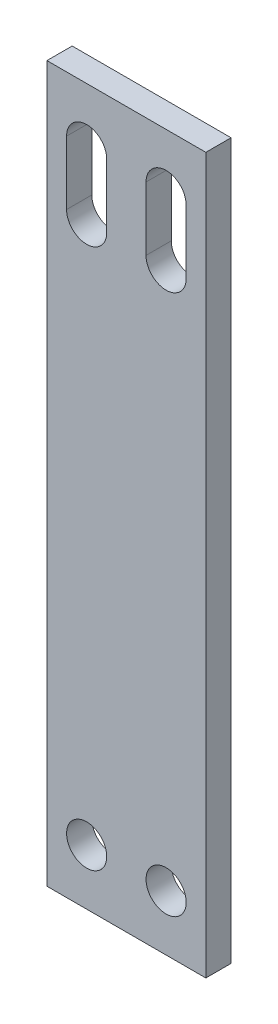
ISO-10303-21;
HEADER;
FILE_DESCRIPTION(('STEP AP214'),'2;1');
FILE_NAME('part.step','',(''),(''),'','','');
FILE_SCHEMA(('AUTOMOTIVE_DESIGN { 1 0 10303 214 1 1 1 1 }'));
ENDSEC;
DATA;
#1=APPLICATION_CONTEXT('core data for automotive mechanical design processes');
#2=APPLICATION_PROTOCOL_DEFINITION('international standard','automotive_design',2000,#1);
#3=PRODUCT_CONTEXT('',#1,'mechanical');
#4=PRODUCT('Part','Part','',(#3));
#5=PRODUCT_RELATED_PRODUCT_CATEGORY('part','',(#4));
#6=PRODUCT_DEFINITION_FORMATION('','',#4);
#7=PRODUCT_DEFINITION_CONTEXT('part definition',#1,'design');
#8=PRODUCT_DEFINITION('design','',#6,#7);
#9=PRODUCT_DEFINITION_SHAPE('','',#8);
#10=(LENGTH_UNIT() NAMED_UNIT(*) SI_UNIT(.MILLI.,.METRE.));
#11=(NAMED_UNIT(*) PLANE_ANGLE_UNIT() SI_UNIT($,.RADIAN.));
#12=(NAMED_UNIT(*) SI_UNIT($,.STERADIAN.) SOLID_ANGLE_UNIT());
#13=UNCERTAINTY_MEASURE_WITH_UNIT(LENGTH_MEASURE(1.E-05),#10,'distance_accuracy_value','');
#14=(GEOMETRIC_REPRESENTATION_CONTEXT(3) GLOBAL_UNCERTAINTY_ASSIGNED_CONTEXT((#13)) GLOBAL_UNIT_ASSIGNED_CONTEXT((#10,
#11,#12)) REPRESENTATION_CONTEXT('',''));
#15=CARTESIAN_POINT('',(0.,0.,0.));
#16=DIRECTION('',(0.,0.,1.));
#17=DIRECTION('',(1.,0.,0.));
#18=AXIS2_PLACEMENT_3D('',#15,#16,#17);
#19=CARTESIAN_POINT('',(0.,0.,3.175));
#20=DIRECTION('',(0.,0.,-1.));
#21=DIRECTION('',(-1.,0.,0.));
#22=AXIS2_PLACEMENT_3D('',#19,#20,#21);
#23=PLANE('',#22);
#24=CARTESIAN_POINT('',(4.99999999999999,83.,3.175));
#25=DIRECTION('',(0.,0.,1.));
#26=DIRECTION('',(1.,0.,0.));
#27=AXIS2_PLACEMENT_3D('',#24,#25,#26);
#28=CIRCLE('',#27,2.5273);
#29=CARTESIAN_POINT('',(7.52729999999999,83.,3.175));
#30=VERTEX_POINT('',#29);
#31=CARTESIAN_POINT('',(2.47269999999999,83.,3.175));
#32=VERTEX_POINT('',#31);
#33=EDGE_CURVE('E158',#30,#32,#28,.T.);
#34=ORIENTED_EDGE('',*,*,#33,.F.);
#35=DIRECTION('',(0.,1.,0.));
#36=VECTOR('',#35,1.);
#37=CARTESIAN_POINT('',(7.52729999999999,83.,3.175));
#38=LINE('',#37,#36);
#39=CARTESIAN_POINT('',(7.52729999999999,75.,3.175));
#40=VERTEX_POINT('',#39);
#41=EDGE_CURVE('E166',#40,#30,#38,.T.);
#42=ORIENTED_EDGE('',*,*,#41,.F.);
#43=CARTESIAN_POINT('',(4.99999999999999,75.,3.175));
#44=DIRECTION('',(0.,0.,1.));
#45=DIRECTION('',(1.,0.,0.));
#46=AXIS2_PLACEMENT_3D('',#43,#44,#45);
#47=CIRCLE('',#46,2.5273);
#48=CARTESIAN_POINT('',(2.47269999999999,75.,3.175));
#49=VERTEX_POINT('',#48);
#50=EDGE_CURVE('E163',#49,#40,#47,.T.);
#51=ORIENTED_EDGE('',*,*,#50,.F.);
#52=DIRECTION('',(0.,-1.,0.));
#53=VECTOR('',#52,1.);
#54=CARTESIAN_POINT('',(2.47269999999999,83.,3.175));
#55=LINE('',#54,#53);
#56=EDGE_CURVE('E160',#32,#49,#55,.T.);
#57=ORIENTED_EDGE('',*,*,#56,.F.);
#58=EDGE_LOOP('',(#34,#42,#51,#57));
#59=FACE_BOUND('',#58,.T.);
#60=DIRECTION('',(0.,-1.,0.));
#61=VECTOR('',#60,1.);
#62=CARTESIAN_POINT('',(0.,0.,3.175));
#63=LINE('',#62,#61);
#64=CARTESIAN_POINT('',(0.,90.,3.175));
#65=VERTEX_POINT('',#64);
#66=CARTESIAN_POINT('',(0.,0.,3.175));
#67=VERTEX_POINT('',#66);
#68=EDGE_CURVE('E201',#65,#67,#63,.T.);
#69=ORIENTED_EDGE('',*,*,#68,.T.);
#70=DIRECTION('',(1.,0.,0.));
#71=VECTOR('',#70,1.);
#72=CARTESIAN_POINT('',(0.,0.,3.175));
#73=LINE('',#72,#71);
#74=CARTESIAN_POINT('',(20.,0.,3.175));
#75=VERTEX_POINT('',#74);
#76=EDGE_CURVE('E204',#67,#75,#73,.T.);
#77=ORIENTED_EDGE('',*,*,#76,.T.);
#78=DIRECTION('',(0.,1.,0.));
#79=VECTOR('',#78,1.);
#80=CARTESIAN_POINT('',(20.,0.,3.175));
#81=LINE('',#80,#79);
#82=CARTESIAN_POINT('',(20.,90.,3.175));
#83=VERTEX_POINT('',#82);
#84=EDGE_CURVE('E207',#75,#83,#81,.T.);
#85=ORIENTED_EDGE('',*,*,#84,.T.);
#86=DIRECTION('',(-1.,0.,0.));
#87=VECTOR('',#86,1.);
#88=CARTESIAN_POINT('',(0.,90.,3.175));
#89=LINE('',#88,#87);
#90=EDGE_CURVE('E209',#83,#65,#89,.T.);
#91=ORIENTED_EDGE('',*,*,#90,.T.);
#92=EDGE_LOOP('',(#69,#77,#85,#91));
#93=FACE_BOUND('',#92,.T.);
#94=CARTESIAN_POINT('',(5.,7.,3.175));
#95=DIRECTION('',(0.,0.,1.));
#96=DIRECTION('',(1.,0.,0.));
#97=AXIS2_PLACEMENT_3D('',#94,#95,#96);
#98=CIRCLE('',#97,2.5273);
#99=CARTESIAN_POINT('',(7.5273,7.,3.175));
#100=VERTEX_POINT('',#99);
#101=EDGE_CURVE('E195',#100,#100,#98,.T.);
#102=ORIENTED_EDGE('',*,*,#101,.F.);
#103=EDGE_LOOP('',(#102));
#104=FACE_BOUND('',#103,.T.);
#105=CARTESIAN_POINT('',(15.,7.,3.175));
#106=DIRECTION('',(0.,0.,1.));
#107=DIRECTION('',(1.,0.,0.));
#108=AXIS2_PLACEMENT_3D('',#105,#106,#107);
#109=CIRCLE('',#108,2.5273);
#110=CARTESIAN_POINT('',(17.5273,7.,3.175));
#111=VERTEX_POINT('',#110);
#112=EDGE_CURVE('E189',#111,#111,#109,.T.);
#113=ORIENTED_EDGE('',*,*,#112,.F.);
#114=EDGE_LOOP('',(#113));
#115=FACE_BOUND('',#114,.T.);
#116=CARTESIAN_POINT('',(15.,75.,3.175));
#117=DIRECTION('',(0.,0.,1.));
#118=DIRECTION('',(1.,0.,0.));
#119=AXIS2_PLACEMENT_3D('',#116,#117,#118);
#120=CIRCLE('',#119,2.5273);
#121=CARTESIAN_POINT('',(12.4727,75.,3.175));
#122=VERTEX_POINT('',#121);
#123=CARTESIAN_POINT('',(17.5273,75.,3.175));
#124=VERTEX_POINT('',#123);
#125=EDGE_CURVE('E122',#122,#124,#120,.T.);
#126=ORIENTED_EDGE('',*,*,#125,.F.);
#127=DIRECTION('',(0.,-1.,0.));
#128=VECTOR('',#127,1.);
#129=CARTESIAN_POINT('',(12.4727,75.,3.175));
#130=LINE('',#129,#128);
#131=CARTESIAN_POINT('',(12.4727,83.,3.175));
#132=VERTEX_POINT('',#131);
#133=EDGE_CURVE('E144',#132,#122,#130,.T.);
#134=ORIENTED_EDGE('',*,*,#133,.F.);
#135=CARTESIAN_POINT('',(15.,83.,3.175));
#136=DIRECTION('',(0.,0.,1.));
#137=DIRECTION('',(1.,0.,0.));
#138=AXIS2_PLACEMENT_3D('',#135,#136,#137);
#139=CIRCLE('',#138,2.5273);
#140=CARTESIAN_POINT('',(17.5273,83.,3.175));
#141=VERTEX_POINT('',#140);
#142=EDGE_CURVE('E142',#141,#132,#139,.T.);
#143=ORIENTED_EDGE('',*,*,#142,.F.);
#144=DIRECTION('',(0.,1.,0.));
#145=VECTOR('',#144,1.);
#146=CARTESIAN_POINT('',(17.5273,75.,3.175));
#147=LINE('',#146,#145);
#148=EDGE_CURVE('E130',#124,#141,#147,.T.);
#149=ORIENTED_EDGE('',*,*,#148,.F.);
#150=EDGE_LOOP('',(#126,#134,#143,#149));
#151=FACE_BOUND('',#150,.T.);
#152=ADVANCED_FACE('F33',(#59,#93,#104,#115,#151),#23,.F.);
#153=CARTESIAN_POINT('',(0.,0.,0.));
#154=DIRECTION('',(0.,0.,-1.));
#155=DIRECTION('',(-1.,0.,0.));
#156=AXIS2_PLACEMENT_3D('',#153,#154,#155);
#157=PLANE('',#156);
#158=CARTESIAN_POINT('',(5.,7.,0.));
#159=DIRECTION('',(0.,0.,1.));
#160=DIRECTION('',(1.,0.,0.));
#161=AXIS2_PLACEMENT_3D('',#158,#159,#160);
#162=CIRCLE('',#161,2.5273);
#163=CARTESIAN_POINT('',(7.5273,7.,0.));
#164=VERTEX_POINT('',#163);
#165=EDGE_CURVE('E192',#164,#164,#162,.T.);
#166=ORIENTED_EDGE('',*,*,#165,.T.);
#167=EDGE_LOOP('',(#166));
#168=FACE_BOUND('',#167,.T.);
#169=DIRECTION('',(0.,-1.,0.));
#170=VECTOR('',#169,1.);
#171=CARTESIAN_POINT('',(0.,0.,0.));
#172=LINE('',#171,#170);
#173=CARTESIAN_POINT('',(0.,90.,0.));
#174=VERTEX_POINT('',#173);
#175=CARTESIAN_POINT('',(0.,0.,0.));
#176=VERTEX_POINT('',#175);
#177=EDGE_CURVE('E198',#174,#176,#172,.T.);
#178=ORIENTED_EDGE('',*,*,#177,.F.);
#179=DIRECTION('',(-1.,0.,0.));
#180=VECTOR('',#179,1.);
#181=CARTESIAN_POINT('',(0.,90.,0.));
#182=LINE('',#181,#180);
#183=CARTESIAN_POINT('',(20.,90.,0.));
#184=VERTEX_POINT('',#183);
#185=EDGE_CURVE('E205',#184,#174,#182,.T.);
#186=ORIENTED_EDGE('',*,*,#185,.F.);
#187=DIRECTION('',(0.,1.,0.));
#188=VECTOR('',#187,1.);
#189=CARTESIAN_POINT('',(20.,0.,0.));
#190=LINE('',#189,#188);
#191=CARTESIAN_POINT('',(20.,0.,0.));
#192=VERTEX_POINT('',#191);
#193=EDGE_CURVE('E216',#192,#184,#190,.T.);
#194=ORIENTED_EDGE('',*,*,#193,.F.);
#195=DIRECTION('',(1.,0.,0.));
#196=VECTOR('',#195,1.);
#197=CARTESIAN_POINT('',(0.,0.,0.));
#198=LINE('',#197,#196);
#199=EDGE_CURVE('E214',#176,#192,#198,.T.);
#200=ORIENTED_EDGE('',*,*,#199,.F.);
#201=EDGE_LOOP('',(#178,#186,#194,#200));
#202=FACE_BOUND('',#201,.T.);
#203=CARTESIAN_POINT('',(15.,7.,0.));
#204=DIRECTION('',(0.,0.,1.));
#205=DIRECTION('',(1.,0.,0.));
#206=AXIS2_PLACEMENT_3D('',#203,#204,#205);
#207=CIRCLE('',#206,2.5273);
#208=CARTESIAN_POINT('',(17.5273,7.,0.));
#209=VERTEX_POINT('',#208);
#210=EDGE_CURVE('E188',#209,#209,#207,.T.);
#211=ORIENTED_EDGE('',*,*,#210,.T.);
#212=EDGE_LOOP('',(#211));
#213=FACE_BOUND('',#212,.T.);
#214=DIRECTION('',(0.,1.,0.));
#215=VECTOR('',#214,1.);
#216=CARTESIAN_POINT('',(7.52729999999999,83.,0.));
#217=LINE('',#216,#215);
#218=CARTESIAN_POINT('',(7.52729999999999,75.,0.));
#219=VERTEX_POINT('',#218);
#220=CARTESIAN_POINT('',(7.52729999999999,83.,0.));
#221=VERTEX_POINT('',#220);
#222=EDGE_CURVE('E161',#219,#221,#217,.T.);
#223=ORIENTED_EDGE('',*,*,#222,.T.);
#224=CARTESIAN_POINT('',(4.99999999999999,83.,0.));
#225=DIRECTION('',(0.,0.,1.));
#226=DIRECTION('',(1.,0.,0.));
#227=AXIS2_PLACEMENT_3D('',#224,#225,#226);
#228=CIRCLE('',#227,2.5273);
#229=CARTESIAN_POINT('',(2.47269999999999,83.,0.));
#230=VERTEX_POINT('',#229);
#231=EDGE_CURVE('E138',#221,#230,#228,.T.);
#232=ORIENTED_EDGE('',*,*,#231,.T.);
#233=DIRECTION('',(0.,-1.,0.));
#234=VECTOR('',#233,1.);
#235=CARTESIAN_POINT('',(2.47269999999999,83.,0.));
#236=LINE('',#235,#234);
#237=CARTESIAN_POINT('',(2.47269999999999,75.,0.));
#238=VERTEX_POINT('',#237);
#239=EDGE_CURVE('E171',#230,#238,#236,.T.);
#240=ORIENTED_EDGE('',*,*,#239,.T.);
#241=CARTESIAN_POINT('',(4.99999999999999,75.,0.));
#242=DIRECTION('',(0.,0.,1.));
#243=DIRECTION('',(1.,0.,0.));
#244=AXIS2_PLACEMENT_3D('',#241,#242,#243);
#245=CIRCLE('',#244,2.5273);
#246=EDGE_CURVE('E174',#238,#219,#245,.T.);
#247=ORIENTED_EDGE('',*,*,#246,.T.);
#248=EDGE_LOOP('',(#223,#232,#240,#247));
#249=FACE_BOUND('',#248,.T.);
#250=DIRECTION('',(0.,-1.,0.));
#251=VECTOR('',#250,1.);
#252=CARTESIAN_POINT('',(12.4727,75.,0.));
#253=LINE('',#252,#251);
#254=CARTESIAN_POINT('',(12.4727,83.,0.));
#255=VERTEX_POINT('',#254);
#256=CARTESIAN_POINT('',(12.4727,75.,0.));
#257=VERTEX_POINT('',#256);
#258=EDGE_CURVE('E131',#255,#257,#253,.T.);
#259=ORIENTED_EDGE('',*,*,#258,.T.);
#260=CARTESIAN_POINT('',(15.,75.,0.));
#261=DIRECTION('',(0.,0.,1.));
#262=DIRECTION('',(1.,0.,0.));
#263=AXIS2_PLACEMENT_3D('',#260,#261,#262);
#264=CIRCLE('',#263,2.5273);
#265=CARTESIAN_POINT('',(17.5273,75.,0.));
#266=VERTEX_POINT('',#265);
#267=EDGE_CURVE('E56',#257,#266,#264,.T.);
#268=ORIENTED_EDGE('',*,*,#267,.T.);
#269=DIRECTION('',(0.,1.,0.));
#270=VECTOR('',#269,1.);
#271=CARTESIAN_POINT('',(17.5273,75.,0.));
#272=LINE('',#271,#270);
#273=CARTESIAN_POINT('',(17.5273,83.,0.));
#274=VERTEX_POINT('',#273);
#275=EDGE_CURVE('E137',#266,#274,#272,.T.);
#276=ORIENTED_EDGE('',*,*,#275,.T.);
#277=CARTESIAN_POINT('',(15.,83.,0.));
#278=DIRECTION('',(0.,0.,1.));
#279=DIRECTION('',(1.,0.,0.));
#280=AXIS2_PLACEMENT_3D('',#277,#278,#279);
#281=CIRCLE('',#280,2.5273);
#282=EDGE_CURVE('E150',#274,#255,#281,.T.);
#283=ORIENTED_EDGE('',*,*,#282,.T.);
#284=EDGE_LOOP('',(#259,#268,#276,#283));
#285=FACE_BOUND('',#284,.T.);
#286=ADVANCED_FACE('F234',(#168,#202,#213,#249,#285),#157,.T.);
#287=CARTESIAN_POINT('',(0.,0.,3.175));
#288=DIRECTION('',(1.,0.,0.));
#289=DIRECTION('',(0.,0.,-1.));
#290=AXIS2_PLACEMENT_3D('',#287,#288,#289);
#291=PLANE('',#290);
#292=ORIENTED_EDGE('',*,*,#177,.T.);
#293=DIRECTION('',(0.,0.,-1.));
#294=VECTOR('',#293,1.);
#295=CARTESIAN_POINT('',(0.,0.,3.175));
#296=LINE('',#295,#294);
#297=EDGE_CURVE('E11',#67,#176,#296,.T.);
#298=ORIENTED_EDGE('',*,*,#297,.F.);
#299=ORIENTED_EDGE('',*,*,#68,.F.);
#300=DIRECTION('',(0.,0.,-1.));
#301=VECTOR('',#300,1.);
#302=CARTESIAN_POINT('',(0.,90.,3.175));
#303=LINE('',#302,#301);
#304=EDGE_CURVE('E211',#65,#174,#303,.T.);
#305=ORIENTED_EDGE('',*,*,#304,.T.);
#306=EDGE_LOOP('',(#292,#298,#299,#305));
#307=FACE_BOUND('',#306,.T.);
#308=ADVANCED_FACE('F35',(#307),#291,.F.);
#309=CARTESIAN_POINT('',(0.,0.,3.175));
#310=DIRECTION('',(0.,1.,0.));
#311=DIRECTION('',(0.,0.,1.));
#312=AXIS2_PLACEMENT_3D('',#309,#310,#311);
#313=PLANE('',#312);
#314=ORIENTED_EDGE('',*,*,#199,.T.);
#315=DIRECTION('',(0.,0.,-1.));
#316=VECTOR('',#315,1.);
#317=CARTESIAN_POINT('',(20.,0.,3.175));
#318=LINE('',#317,#316);
#319=EDGE_CURVE('E41',#75,#192,#318,.T.);
#320=ORIENTED_EDGE('',*,*,#319,.F.);
#321=ORIENTED_EDGE('',*,*,#76,.F.);
#322=ORIENTED_EDGE('',*,*,#297,.T.);
#323=EDGE_LOOP('',(#314,#320,#321,#322));
#324=FACE_BOUND('',#323,.T.);
#325=ADVANCED_FACE('F245',(#324),#313,.F.);
#326=CARTESIAN_POINT('',(20.,0.,3.175));
#327=DIRECTION('',(-1.,0.,0.));
#328=DIRECTION('',(0.,0.,1.));
#329=AXIS2_PLACEMENT_3D('',#326,#327,#328);
#330=PLANE('',#329);
#331=ORIENTED_EDGE('',*,*,#193,.T.);
#332=DIRECTION('',(0.,0.,-1.));
#333=VECTOR('',#332,1.);
#334=CARTESIAN_POINT('',(20.,90.,3.175));
#335=LINE('',#334,#333);
#336=EDGE_CURVE('E221',#83,#184,#335,.T.);
#337=ORIENTED_EDGE('',*,*,#336,.F.);
#338=ORIENTED_EDGE('',*,*,#84,.F.);
#339=ORIENTED_EDGE('',*,*,#319,.T.);
#340=EDGE_LOOP('',(#331,#337,#338,#339));
#341=FACE_BOUND('',#340,.T.);
#342=ADVANCED_FACE('F228',(#341),#330,.F.);
#343=CARTESIAN_POINT('',(0.,90.,3.175));
#344=DIRECTION('',(0.,-1.,0.));
#345=DIRECTION('',(0.,0.,-1.));
#346=AXIS2_PLACEMENT_3D('',#343,#344,#345);
#347=PLANE('',#346);
#348=ORIENTED_EDGE('',*,*,#185,.T.);
#349=ORIENTED_EDGE('',*,*,#304,.F.);
#350=ORIENTED_EDGE('',*,*,#90,.F.);
#351=ORIENTED_EDGE('',*,*,#336,.T.);
#352=EDGE_LOOP('',(#348,#349,#350,#351));
#353=FACE_BOUND('',#352,.T.);
#354=ADVANCED_FACE('F238',(#353),#347,.F.);
#355=CARTESIAN_POINT('',(5.,7.,3.175));
#356=DIRECTION('',(0.,0.,-1.));
#357=DIRECTION('',(-1.,0.,0.));
#358=AXIS2_PLACEMENT_3D('',#355,#356,#357);
#359=CYLINDRICAL_SURFACE('',#358,2.5273);
#360=ORIENTED_EDGE('',*,*,#101,.T.);
#361=EDGE_LOOP('',(#360));
#362=FACE_BOUND('',#361,.T.);
#363=ORIENTED_EDGE('',*,*,#165,.F.);
#364=EDGE_LOOP('',(#363));
#365=FACE_BOUND('',#364,.T.);
#366=ADVANCED_FACE('F262',(#362,#365),#359,.F.);
#367=CARTESIAN_POINT('',(15.,7.,3.175));
#368=DIRECTION('',(0.,0.,-1.));
#369=DIRECTION('',(-1.,0.,0.));
#370=AXIS2_PLACEMENT_3D('',#367,#368,#369);
#371=CYLINDRICAL_SURFACE('',#370,2.5273);
#372=ORIENTED_EDGE('',*,*,#112,.T.);
#373=EDGE_LOOP('',(#372));
#374=FACE_BOUND('',#373,.T.);
#375=ORIENTED_EDGE('',*,*,#210,.F.);
#376=EDGE_LOOP('',(#375));
#377=FACE_BOUND('',#376,.T.);
#378=ADVANCED_FACE('F269',(#374,#377),#371,.F.);
#379=CARTESIAN_POINT('',(4.99999999999999,83.,3.175));
#380=DIRECTION('',(0.,0.,-1.));
#381=DIRECTION('',(-1.,0.,0.));
#382=AXIS2_PLACEMENT_3D('',#379,#380,#381);
#383=CYLINDRICAL_SURFACE('',#382,2.5273);
#384=ORIENTED_EDGE('',*,*,#231,.F.);
#385=DIRECTION('',(0.,0.,-1.));
#386=VECTOR('',#385,1.);
#387=CARTESIAN_POINT('',(7.52729999999999,83.,3.175));
#388=LINE('',#387,#386);
#389=EDGE_CURVE('E168',#30,#221,#388,.T.);
#390=ORIENTED_EDGE('',*,*,#389,.F.);
#391=ORIENTED_EDGE('',*,*,#33,.T.);
#392=DIRECTION('',(0.,0.,-1.));
#393=VECTOR('',#392,1.);
#394=CARTESIAN_POINT('',(2.47269999999999,83.,3.175));
#395=LINE('',#394,#393);
#396=EDGE_CURVE('E185',#32,#230,#395,.T.);
#397=ORIENTED_EDGE('',*,*,#396,.T.);
#398=EDGE_LOOP('',(#384,#390,#391,#397));
#399=FACE_BOUND('',#398,.T.);
#400=ADVANCED_FACE('F274',(#399),#383,.F.);
#401=CARTESIAN_POINT('',(2.47269999999999,83.,3.175));
#402=DIRECTION('',(1.,0.,0.));
#403=DIRECTION('',(0.,1.,0.));
#404=AXIS2_PLACEMENT_3D('',#401,#402,#403);
#405=PLANE('',#404);
#406=ORIENTED_EDGE('',*,*,#239,.F.);
#407=ORIENTED_EDGE('',*,*,#396,.F.);
#408=ORIENTED_EDGE('',*,*,#56,.T.);
#409=DIRECTION('',(0.,0.,-1.));
#410=VECTOR('',#409,1.);
#411=CARTESIAN_POINT('',(2.47269999999999,75.,3.175));
#412=LINE('',#411,#410);
#413=EDGE_CURVE('E183',#49,#238,#412,.T.);
#414=ORIENTED_EDGE('',*,*,#413,.T.);
#415=EDGE_LOOP('',(#406,#407,#408,#414));
#416=FACE_BOUND('',#415,.T.);
#417=ADVANCED_FACE('F308',(#416),#405,.T.);
#418=CARTESIAN_POINT('',(4.99999999999999,75.,3.175));
#419=DIRECTION('',(0.,0.,-1.));
#420=DIRECTION('',(-1.,0.,0.));
#421=AXIS2_PLACEMENT_3D('',#418,#419,#420);
#422=CYLINDRICAL_SURFACE('',#421,2.5273);
#423=ORIENTED_EDGE('',*,*,#246,.F.);
#424=ORIENTED_EDGE('',*,*,#413,.F.);
#425=ORIENTED_EDGE('',*,*,#50,.T.);
#426=DIRECTION('',(0.,0.,-1.));
#427=VECTOR('',#426,1.);
#428=CARTESIAN_POINT('',(7.52729999999999,75.,3.175));
#429=LINE('',#428,#427);
#430=EDGE_CURVE('E181',#40,#219,#429,.T.);
#431=ORIENTED_EDGE('',*,*,#430,.T.);
#432=EDGE_LOOP('',(#423,#424,#425,#431));
#433=FACE_BOUND('',#432,.T.);
#434=ADVANCED_FACE('F304',(#433),#422,.F.);
#435=CARTESIAN_POINT('',(7.52729999999999,83.,3.175));
#436=DIRECTION('',(-1.,0.,0.));
#437=DIRECTION('',(0.,-1.,0.));
#438=AXIS2_PLACEMENT_3D('',#435,#436,#437);
#439=PLANE('',#438);
#440=ORIENTED_EDGE('',*,*,#222,.F.);
#441=ORIENTED_EDGE('',*,*,#430,.F.);
#442=ORIENTED_EDGE('',*,*,#41,.T.);
#443=ORIENTED_EDGE('',*,*,#389,.T.);
#444=EDGE_LOOP('',(#440,#441,#442,#443));
#445=FACE_BOUND('',#444,.T.);
#446=ADVANCED_FACE('F301',(#445),#439,.T.);
#447=CARTESIAN_POINT('',(15.,75.,3.175));
#448=DIRECTION('',(0.,0.,-1.));
#449=DIRECTION('',(-1.,0.,0.));
#450=AXIS2_PLACEMENT_3D('',#447,#448,#449);
#451=CYLINDRICAL_SURFACE('',#450,2.5273);
#452=ORIENTED_EDGE('',*,*,#267,.F.);
#453=DIRECTION('',(0.,0.,-1.));
#454=VECTOR('',#453,1.);
#455=CARTESIAN_POINT('',(12.4727,75.,3.175));
#456=LINE('',#455,#454);
#457=EDGE_CURVE('E126',#122,#257,#456,.T.);
#458=ORIENTED_EDGE('',*,*,#457,.F.);
#459=ORIENTED_EDGE('',*,*,#125,.T.);
#460=DIRECTION('',(0.,0.,-1.));
#461=VECTOR('',#460,1.);
#462=CARTESIAN_POINT('',(17.5273,75.,3.175));
#463=LINE('',#462,#461);
#464=EDGE_CURVE('E125',#124,#266,#463,.T.);
#465=ORIENTED_EDGE('',*,*,#464,.T.);
#466=EDGE_LOOP('',(#452,#458,#459,#465));
#467=FACE_BOUND('',#466,.T.);
#468=ADVANCED_FACE('F124',(#467),#451,.F.);
#469=CARTESIAN_POINT('',(17.5273,75.,3.175));
#470=DIRECTION('',(-1.,0.,0.));
#471=DIRECTION('',(0.,0.,1.));
#472=AXIS2_PLACEMENT_3D('',#469,#470,#471);
#473=PLANE('',#472);
#474=ORIENTED_EDGE('',*,*,#275,.F.);
#475=ORIENTED_EDGE('',*,*,#464,.F.);
#476=ORIENTED_EDGE('',*,*,#148,.T.);
#477=DIRECTION('',(0.,0.,-1.));
#478=VECTOR('',#477,1.);
#479=CARTESIAN_POINT('',(17.5273,83.,3.175));
#480=LINE('',#479,#478);
#481=EDGE_CURVE('E139',#141,#274,#480,.T.);
#482=ORIENTED_EDGE('',*,*,#481,.T.);
#483=EDGE_LOOP('',(#474,#475,#476,#482));
#484=FACE_BOUND('',#483,.T.);
#485=ADVANCED_FACE('F134',(#484),#473,.T.);
#486=CARTESIAN_POINT('',(15.,83.,3.175));
#487=DIRECTION('',(0.,0.,-1.));
#488=DIRECTION('',(-1.,0.,0.));
#489=AXIS2_PLACEMENT_3D('',#486,#487,#488);
#490=CYLINDRICAL_SURFACE('',#489,2.5273);
#491=ORIENTED_EDGE('',*,*,#282,.F.);
#492=ORIENTED_EDGE('',*,*,#481,.F.);
#493=ORIENTED_EDGE('',*,*,#142,.T.);
#494=DIRECTION('',(0.,0.,-1.));
#495=VECTOR('',#494,1.);
#496=CARTESIAN_POINT('',(12.4727,83.,3.175));
#497=LINE('',#496,#495);
#498=EDGE_CURVE('E48',#132,#255,#497,.T.);
#499=ORIENTED_EDGE('',*,*,#498,.T.);
#500=EDGE_LOOP('',(#491,#492,#493,#499));
#501=FACE_BOUND('',#500,.T.);
#502=ADVANCED_FACE('F289',(#501),#490,.F.);
#503=CARTESIAN_POINT('',(12.4727,75.,3.175));
#504=DIRECTION('',(1.,0.,0.));
#505=DIRECTION('',(0.,0.,-1.));
#506=AXIS2_PLACEMENT_3D('',#503,#504,#505);
#507=PLANE('',#506);
#508=ORIENTED_EDGE('',*,*,#258,.F.);
#509=ORIENTED_EDGE('',*,*,#498,.F.);
#510=ORIENTED_EDGE('',*,*,#133,.T.);
#511=ORIENTED_EDGE('',*,*,#457,.T.);
#512=EDGE_LOOP('',(#508,#509,#510,#511));
#513=FACE_BOUND('',#512,.T.);
#514=ADVANCED_FACE('F287',(#513),#507,.T.);
#515=CLOSED_SHELL('',(#152,#286,#308,#325,#342,#354,#366,#378,#400,#417,#434,#446,#468,#485,
#502,#514));
#516=MANIFOLD_SOLID_BREP('B2',#515);
#517=ADVANCED_BREP_SHAPE_REPRESENTATION('',(#18,#516),#14);
#518=SHAPE_DEFINITION_REPRESENTATION(#9,#517);
ENDSEC;
END-ISO-10303-21;
